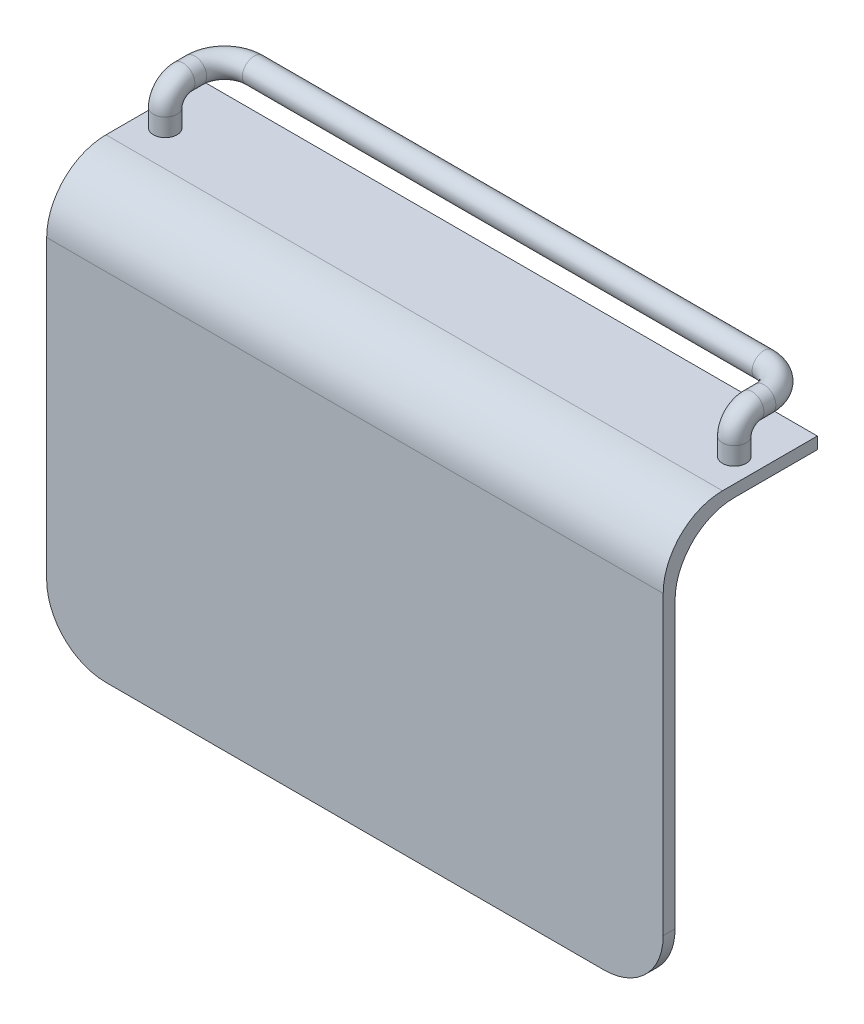
ISO-10303-21;
HEADER;
FILE_DESCRIPTION(('STEP AP214'),'2;1');
FILE_NAME('part.step','',(''),(''),'','','');
FILE_SCHEMA(('AUTOMOTIVE_DESIGN { 1 0 10303 214 1 1 1 1 }'));
ENDSEC;
DATA;
#1=APPLICATION_CONTEXT('core data for automotive mechanical design processes');
#2=APPLICATION_PROTOCOL_DEFINITION('international standard','automotive_design',2000,#1);
#3=PRODUCT_CONTEXT('',#1,'mechanical');
#4=PRODUCT('Part','Part','',(#3));
#5=PRODUCT_RELATED_PRODUCT_CATEGORY('part','',(#4));
#6=PRODUCT_DEFINITION_FORMATION('','',#4);
#7=PRODUCT_DEFINITION_CONTEXT('part definition',#1,'design');
#8=PRODUCT_DEFINITION('design','',#6,#7);
#9=PRODUCT_DEFINITION_SHAPE('','',#8);
#10=(LENGTH_UNIT() NAMED_UNIT(*) SI_UNIT(.MILLI.,.METRE.));
#11=(NAMED_UNIT(*) PLANE_ANGLE_UNIT() SI_UNIT($,.RADIAN.));
#12=(NAMED_UNIT(*) SI_UNIT($,.STERADIAN.) SOLID_ANGLE_UNIT());
#13=UNCERTAINTY_MEASURE_WITH_UNIT(LENGTH_MEASURE(1.E-05),#10,'distance_accuracy_value','');
#14=(GEOMETRIC_REPRESENTATION_CONTEXT(3) GLOBAL_UNCERTAINTY_ASSIGNED_CONTEXT((#13)) GLOBAL_UNIT_ASSIGNED_CONTEXT((#10,
#11,#12)) REPRESENTATION_CONTEXT('',''));
#15=CARTESIAN_POINT('',(0.,0.,0.));
#16=DIRECTION('',(0.,0.,1.));
#17=DIRECTION('',(1.,0.,0.));
#18=AXIS2_PLACEMENT_3D('',#15,#16,#17);
#19=CARTESIAN_POINT('',(-520.,-730.,240.));
#20=DIRECTION('',(0.,0.,1.));
#21=DIRECTION('',(1.,0.,0.));
#22=AXIS2_PLACEMENT_3D('',#19,#20,#21);
#23=PLANE('',#22);
#24=DIRECTION('',(1.,0.,0.));
#25=VECTOR('',#24,1.);
#26=CARTESIAN_POINT('',(-520.,-730.,240.));
#27=LINE('',#26,#25);
#28=CARTESIAN_POINT('',(-491.414284285429,-730.,240.));
#29=VERTEX_POINT('',#28);
#30=CARTESIAN_POINT('',(491.414284285429,-730.,240.));
#31=VERTEX_POINT('',#30);
#32=EDGE_CURVE('E221',#29,#31,#27,.T.);
#33=ORIENTED_EDGE('',*,*,#32,.F.);
#34=CARTESIAN_POINT('',(-420.,-660.,240.));
#35=DIRECTION('',(0.,0.,1.));
#36=DIRECTION('',(1.,0.,0.));
#37=AXIS2_PLACEMENT_3D('',#34,#35,#36);
#38=CIRCLE('',#37,100.);
#39=CARTESIAN_POINT('',(-520.,-660.,240.));
#40=VERTEX_POINT('',#39);
#41=EDGE_CURVE('E207',#29,#40,#38,.F.);
#42=ORIENTED_EDGE('',*,*,#41,.T.);
#43=DIRECTION('',(0.,1.,0.));
#44=VECTOR('',#43,1.);
#45=CARTESIAN_POINT('',(-520.,-730.,240.));
#46=LINE('',#45,#44);
#47=CARTESIAN_POINT('',(-520.,-180.,240.));
#48=VERTEX_POINT('',#47);
#49=EDGE_CURVE('E248',#40,#48,#46,.T.);
#50=ORIENTED_EDGE('',*,*,#49,.T.);
#51=DIRECTION('',(-1.,0.,0.));
#52=VECTOR('',#51,1.);
#53=CARTESIAN_POINT('',(520.,-180.,240.));
#54=LINE('',#53,#52);
#55=CARTESIAN_POINT('',(520.,-180.,240.));
#56=VERTEX_POINT('',#55);
#57=EDGE_CURVE('E238',#56,#48,#54,.T.);
#58=ORIENTED_EDGE('',*,*,#57,.F.);
#59=DIRECTION('',(0.,1.,0.));
#60=VECTOR('',#59,1.);
#61=CARTESIAN_POINT('',(520.,-730.,240.));
#62=LINE('',#61,#60);
#63=CARTESIAN_POINT('',(520.,-660.,240.));
#64=VERTEX_POINT('',#63);
#65=EDGE_CURVE('E246',#64,#56,#62,.T.);
#66=ORIENTED_EDGE('',*,*,#65,.F.);
#67=CARTESIAN_POINT('',(420.,-660.,240.));
#68=DIRECTION('',(0.,0.,1.));
#69=DIRECTION('',(1.,0.,0.));
#70=AXIS2_PLACEMENT_3D('',#67,#68,#69);
#71=CIRCLE('',#70,100.);
#72=EDGE_CURVE('E205',#64,#31,#71,.F.);
#73=ORIENTED_EDGE('',*,*,#72,.T.);
#74=EDGE_LOOP('',(#33,#42,#50,#58,#66,#73));
#75=FACE_BOUND('',#74,.T.);
#76=ADVANCED_FACE('F32',(#75),#23,.F.);
#77=CARTESIAN_POINT('',(0.,-80.0000000000001,0.));
#78=DIRECTION('',(0.,1.,0.));
#79=DIRECTION('',(0.,0.,1.));
#80=AXIS2_PLACEMENT_3D('',#77,#78,#79);
#81=PLANE('',#80);
#82=DIRECTION('',(0.,0.,1.));
#83=VECTOR('',#82,1.);
#84=CARTESIAN_POINT('',(520.,-80.0000000000001,260.));
#85=LINE('',#84,#83);
#86=CARTESIAN_POINT('',(520.,-80.0000000000001,0.));
#87=VERTEX_POINT('',#86);
#88=CARTESIAN_POINT('',(520.,-80.0000000000001,140.));
#89=VERTEX_POINT('',#88);
#90=EDGE_CURVE('E121',#87,#89,#85,.T.);
#91=ORIENTED_EDGE('',*,*,#90,.T.);
#92=DIRECTION('',(-1.,0.,0.));
#93=VECTOR('',#92,1.);
#94=CARTESIAN_POINT('',(520.,-80.,140.));
#95=LINE('',#94,#93);
#96=CARTESIAN_POINT('',(-520.,-80.0000000000001,140.));
#97=VERTEX_POINT('',#96);
#98=EDGE_CURVE('E242',#89,#97,#95,.T.);
#99=ORIENTED_EDGE('',*,*,#98,.T.);
#100=DIRECTION('',(0.,0.,-1.));
#101=VECTOR('',#100,1.);
#102=CARTESIAN_POINT('',(-520.,-80.0000000000001,260.));
#103=LINE('',#102,#101);
#104=CARTESIAN_POINT('',(-520.,-80.0000000000001,0.));
#105=VERTEX_POINT('',#104);
#106=EDGE_CURVE('E131',#97,#105,#103,.T.);
#107=ORIENTED_EDGE('',*,*,#106,.T.);
#108=DIRECTION('',(1.,0.,0.));
#109=VECTOR('',#108,1.);
#110=CARTESIAN_POINT('',(0.,-80.0000000000001,0.));
#111=LINE('',#110,#109);
#112=EDGE_CURVE('E132',#105,#87,#111,.T.);
#113=ORIENTED_EDGE('',*,*,#112,.T.);
#114=EDGE_LOOP('',(#91,#99,#107,#113));
#115=FACE_BOUND('',#114,.T.);
#116=ADVANCED_FACE('F135',(#115),#81,.F.);
#117=CARTESIAN_POINT('',(0.,0.,0.));
#118=DIRECTION('',(-1.,0.,0.));
#119=DIRECTION('',(0.,0.,1.));
#120=AXIS2_PLACEMENT_3D('',#117,#118,#119);
#121=CYLINDRICAL_SURFACE('',#120,20.);
#122=CARTESIAN_POINT('',(-430.,0.,0.));
#123=DIRECTION('',(1.,0.,0.));
#124=DIRECTION('',(0.,1.,0.));
#125=AXIS2_PLACEMENT_3D('',#122,#123,#124);
#126=CIRCLE('',#125,20.);
#127=CARTESIAN_POINT('',(-430.,0.,-20.));
#128=VERTEX_POINT('',#127);
#129=EDGE_CURVE('E166',#128,#128,#126,.T.);
#130=ORIENTED_EDGE('',*,*,#129,.T.);
#131=EDGE_LOOP('',(#130));
#132=FACE_BOUND('',#131,.T.);
#133=CARTESIAN_POINT('',(430.,0.,0.));
#134=DIRECTION('',(1.,0.,0.));
#135=DIRECTION('',(0.,1.,0.));
#136=AXIS2_PLACEMENT_3D('',#133,#134,#135);
#137=CIRCLE('',#136,20.);
#138=CARTESIAN_POINT('',(430.,0.,-20.));
#139=VERTEX_POINT('',#138);
#140=EDGE_CURVE('E155',#139,#139,#137,.F.);
#141=ORIENTED_EDGE('',*,*,#140,.T.);
#142=EDGE_LOOP('',(#141));
#143=FACE_BOUND('',#142,.T.);
#144=ADVANCED_FACE('F290',(#132,#143),#121,.T.);
#145=CARTESIAN_POINT('',(-430.,0.,50.));
#146=DIRECTION('',(0.,1.,0.));
#147=DIRECTION('',(0.,0.,1.));
#148=AXIS2_PLACEMENT_3D('',#145,#146,#147);
#149=TOROIDAL_SURFACE('',#148,50.,20.);
#150=CARTESIAN_POINT('',(-480.,0.,50.));
#151=DIRECTION('',(0.,0.,-1.));
#152=DIRECTION('',(0.,1.,0.));
#153=AXIS2_PLACEMENT_3D('',#150,#151,#152);
#154=CIRCLE('',#153,20.);
#155=CARTESIAN_POINT('',(-500.,0.,50.));
#156=VERTEX_POINT('',#155);
#157=EDGE_CURVE('E170',#156,#156,#154,.T.);
#158=CARTESIAN_POINT('',(-430.,0.,50.));
#159=DIRECTION('',(0.,1.,0.));
#160=DIRECTION('',(0.,0.,1.));
#161=AXIS2_PLACEMENT_3D('',#158,#159,#160);
#162=CIRCLE('',#161,70.);
#163=EDGE_CURVE('',#128,#156,#162,.T.);
#164=ORIENTED_EDGE('',*,*,#129,.F.);
#165=ORIENTED_EDGE('',*,*,#157,.T.);
#166=ORIENTED_EDGE('',*,*,#163,.T.);
#167=ORIENTED_EDGE('',*,*,#163,.F.);
#168=EDGE_LOOP('',(#164,#166,#165,#167));
#169=FACE_BOUND('',#168,.T.);
#170=ADVANCED_FACE('F325',(#169),#149,.T.);
#171=CARTESIAN_POINT('',(-480.,0.,50.));
#172=DIRECTION('',(0.,0.,1.));
#173=DIRECTION('',(0.,-1.,0.));
#174=AXIS2_PLACEMENT_3D('',#171,#172,#173);
#175=CYLINDRICAL_SURFACE('',#174,20.);
#176=CARTESIAN_POINT('',(-480.,0.,70.));
#177=DIRECTION('',(0.,0.,-1.));
#178=DIRECTION('',(0.,1.,0.));
#179=AXIS2_PLACEMENT_3D('',#176,#177,#178);
#180=CIRCLE('',#179,20.);
#181=CARTESIAN_POINT('',(-480.,20.,70.));
#182=VERTEX_POINT('',#181);
#183=EDGE_CURVE('E173',#182,#182,#180,.T.);
#184=ORIENTED_EDGE('',*,*,#183,.T.);
#185=EDGE_LOOP('',(#184));
#186=FACE_BOUND('',#185,.T.);
#187=ORIENTED_EDGE('',*,*,#157,.F.);
#188=EDGE_LOOP('',(#187));
#189=FACE_BOUND('',#188,.T.);
#190=ADVANCED_FACE('F329',(#186,#189),#175,.T.);
#191=CARTESIAN_POINT('',(-480.,-30.,70.));
#192=DIRECTION('',(1.,0.,0.));
#193=DIRECTION('',(0.,0.,-1.));
#194=AXIS2_PLACEMENT_3D('',#191,#192,#193);
#195=TOROIDAL_SURFACE('',#194,30.,20.);
#196=CARTESIAN_POINT('',(-480.,-30.,100.));
#197=DIRECTION('',(0.,1.,0.));
#198=DIRECTION('',(0.,0.,1.));
#199=AXIS2_PLACEMENT_3D('',#196,#197,#198);
#200=CIRCLE('',#199,20.);
#201=CARTESIAN_POINT('',(-480.,-29.9999999999999,120.));
#202=VERTEX_POINT('',#201);
#203=EDGE_CURVE('E176',#202,#202,#200,.T.);
#204=CARTESIAN_POINT('',(-480.,-30.,70.));
#205=DIRECTION('',(1.,0.,0.));
#206=DIRECTION('',(0.,0.,-1.));
#207=AXIS2_PLACEMENT_3D('',#204,#205,#206);
#208=CIRCLE('',#207,50.);
#209=EDGE_CURVE('',#182,#202,#208,.T.);
#210=ORIENTED_EDGE('',*,*,#183,.F.);
#211=ORIENTED_EDGE('',*,*,#203,.T.);
#212=ORIENTED_EDGE('',*,*,#209,.T.);
#213=ORIENTED_EDGE('',*,*,#209,.F.);
#214=EDGE_LOOP('',(#210,#212,#211,#213));
#215=FACE_BOUND('',#214,.T.);
#216=ADVANCED_FACE('F333',(#215),#195,.T.);
#217=CARTESIAN_POINT('',(-480.,-30.,100.));
#218=DIRECTION('',(0.,-1.,0.));
#219=DIRECTION('',(0.,0.,-1.));
#220=AXIS2_PLACEMENT_3D('',#217,#218,#219);
#221=CYLINDRICAL_SURFACE('',#220,20.);
#222=CARTESIAN_POINT('',(-480.,-60.0000000000001,100.));
#223=DIRECTION('',(0.,1.,0.));
#224=DIRECTION('',(0.,0.,1.));
#225=AXIS2_PLACEMENT_3D('',#222,#223,#224);
#226=CIRCLE('',#225,20.);
#227=CARTESIAN_POINT('',(-480.,-60.0000000000001,120.));
#228=VERTEX_POINT('',#227);
#229=EDGE_CURVE('E149',#228,#228,#226,.T.);
#230=ORIENTED_EDGE('',*,*,#229,.T.);
#231=EDGE_LOOP('',(#230));
#232=FACE_BOUND('',#231,.T.);
#233=ORIENTED_EDGE('',*,*,#203,.F.);
#234=EDGE_LOOP('',(#233));
#235=FACE_BOUND('',#234,.T.);
#236=ADVANCED_FACE('F292',(#232,#235),#221,.T.);
#237=CARTESIAN_POINT('',(430.,0.,50.));
#238=DIRECTION('',(0.,-1.,0.));
#239=DIRECTION('',(0.,0.,-1.));
#240=AXIS2_PLACEMENT_3D('',#237,#238,#239);
#241=TOROIDAL_SURFACE('',#240,50.,20.);
#242=CARTESIAN_POINT('',(480.,0.,50.));
#243=DIRECTION('',(0.,0.,1.));
#244=DIRECTION('',(0.,1.,0.));
#245=AXIS2_PLACEMENT_3D('',#242,#243,#244);
#246=CIRCLE('',#245,20.);
#247=CARTESIAN_POINT('',(500.,0.,50.));
#248=VERTEX_POINT('',#247);
#249=EDGE_CURVE('E158',#248,#248,#246,.F.);
#250=CARTESIAN_POINT('',(430.,0.,50.));
#251=DIRECTION('',(0.,-1.,0.));
#252=DIRECTION('',(0.,0.,-1.));
#253=AXIS2_PLACEMENT_3D('',#250,#251,#252);
#254=CIRCLE('',#253,70.);
#255=EDGE_CURVE('',#139,#248,#254,.T.);
#256=ORIENTED_EDGE('',*,*,#140,.F.);
#257=ORIENTED_EDGE('',*,*,#249,.T.);
#258=ORIENTED_EDGE('',*,*,#255,.T.);
#259=ORIENTED_EDGE('',*,*,#255,.F.);
#260=EDGE_LOOP('',(#256,#258,#257,#259));
#261=FACE_BOUND('',#260,.T.);
#262=ADVANCED_FACE('F308',(#261),#241,.T.);
#263=CARTESIAN_POINT('',(480.,0.,50.));
#264=DIRECTION('',(0.,0.,1.));
#265=DIRECTION('',(0.,-1.,0.));
#266=AXIS2_PLACEMENT_3D('',#263,#264,#265);
#267=CYLINDRICAL_SURFACE('',#266,20.);
#268=CARTESIAN_POINT('',(480.,0.,70.));
#269=DIRECTION('',(0.,0.,1.));
#270=DIRECTION('',(0.,1.,0.));
#271=AXIS2_PLACEMENT_3D('',#268,#269,#270);
#272=CIRCLE('',#271,20.);
#273=CARTESIAN_POINT('',(480.,20.,70.));
#274=VERTEX_POINT('',#273);
#275=EDGE_CURVE('E161',#274,#274,#272,.F.);
#276=ORIENTED_EDGE('',*,*,#275,.T.);
#277=EDGE_LOOP('',(#276));
#278=FACE_BOUND('',#277,.T.);
#279=ORIENTED_EDGE('',*,*,#249,.F.);
#280=EDGE_LOOP('',(#279));
#281=FACE_BOUND('',#280,.T.);
#282=ADVANCED_FACE('F311',(#278,#281),#267,.T.);
#283=CARTESIAN_POINT('',(480.,-30.,70.));
#284=DIRECTION('',(1.,0.,0.));
#285=DIRECTION('',(0.,0.,-1.));
#286=AXIS2_PLACEMENT_3D('',#283,#284,#285);
#287=TOROIDAL_SURFACE('',#286,30.,20.);
#288=CARTESIAN_POINT('',(480.,-30.,100.));
#289=DIRECTION('',(0.,-1.,0.));
#290=DIRECTION('',(0.,0.,1.));
#291=AXIS2_PLACEMENT_3D('',#288,#289,#290);
#292=CIRCLE('',#291,20.);
#293=CARTESIAN_POINT('',(480.,-29.9999999999999,120.));
#294=VERTEX_POINT('',#293);
#295=EDGE_CURVE('E164',#294,#294,#292,.F.);
#296=CARTESIAN_POINT('',(480.,-30.,70.));
#297=DIRECTION('',(1.,0.,0.));
#298=DIRECTION('',(0.,0.,-1.));
#299=AXIS2_PLACEMENT_3D('',#296,#297,#298);
#300=CIRCLE('',#299,50.);
#301=EDGE_CURVE('',#274,#294,#300,.T.);
#302=ORIENTED_EDGE('',*,*,#275,.F.);
#303=ORIENTED_EDGE('',*,*,#295,.T.);
#304=ORIENTED_EDGE('',*,*,#301,.T.);
#305=ORIENTED_EDGE('',*,*,#301,.F.);
#306=EDGE_LOOP('',(#302,#304,#303,#305));
#307=FACE_BOUND('',#306,.T.);
#308=ADVANCED_FACE('F315',(#307),#287,.T.);
#309=CARTESIAN_POINT('',(480.,-30.,100.));
#310=DIRECTION('',(0.,-1.,0.));
#311=DIRECTION('',(0.,0.,-1.));
#312=AXIS2_PLACEMENT_3D('',#309,#310,#311);
#313=CYLINDRICAL_SURFACE('',#312,20.);
#314=CARTESIAN_POINT('',(480.,-60.0000000000001,100.));
#315=DIRECTION('',(0.,-1.,0.));
#316=DIRECTION('',(0.,0.,1.));
#317=AXIS2_PLACEMENT_3D('',#314,#315,#316);
#318=CIRCLE('',#317,20.);
#319=CARTESIAN_POINT('',(480.,-60.0000000000001,120.));
#320=VERTEX_POINT('',#319);
#321=EDGE_CURVE('E145',#320,#320,#318,.F.);
#322=ORIENTED_EDGE('',*,*,#321,.T.);
#323=EDGE_LOOP('',(#322));
#324=FACE_BOUND('',#323,.T.);
#325=ORIENTED_EDGE('',*,*,#295,.F.);
#326=EDGE_LOOP('',(#325));
#327=FACE_BOUND('',#326,.T.);
#328=ADVANCED_FACE('F307',(#324,#327),#313,.T.);
#329=CARTESIAN_POINT('',(520.,-80.0000000000001,260.));
#330=DIRECTION('',(-1.,0.,0.));
#331=DIRECTION('',(0.,0.,1.));
#332=AXIS2_PLACEMENT_3D('',#329,#330,#331);
#333=PLANE('',#332);
#334=DIRECTION('',(0.,1.,0.));
#335=VECTOR('',#334,1.);
#336=CARTESIAN_POINT('',(520.,-80.0000000000001,260.));
#337=LINE('',#336,#335);
#338=CARTESIAN_POINT('',(520.,-660.,260.));
#339=VERTEX_POINT('',#338);
#340=CARTESIAN_POINT('',(520.,-160.,260.));
#341=VERTEX_POINT('',#340);
#342=EDGE_CURVE('E146',#339,#341,#337,.T.);
#343=ORIENTED_EDGE('',*,*,#342,.F.);
#344=DIRECTION('',(0.,0.,1.));
#345=VECTOR('',#344,1.);
#346=CARTESIAN_POINT('',(520.,-660.,260.));
#347=LINE('',#346,#345);
#348=EDGE_CURVE('E11',#339,#64,#347,.F.);
#349=ORIENTED_EDGE('',*,*,#348,.T.);
#350=ORIENTED_EDGE('',*,*,#65,.T.);
#351=CARTESIAN_POINT('',(520.,-180.,140.));
#352=DIRECTION('',(-1.,0.,0.));
#353=DIRECTION('',(0.,0.,-1.));
#354=AXIS2_PLACEMENT_3D('',#351,#352,#353);
#355=CIRCLE('',#354,100.);
#356=EDGE_CURVE('E128',#56,#89,#355,.T.);
#357=ORIENTED_EDGE('',*,*,#356,.T.);
#358=ORIENTED_EDGE('',*,*,#90,.F.);
#359=DIRECTION('',(0.,1.,0.));
#360=VECTOR('',#359,1.);
#361=CARTESIAN_POINT('',(520.,-80.0000000000001,0.));
#362=LINE('',#361,#360);
#363=CARTESIAN_POINT('',(520.,-60.0000000000001,0.));
#364=VERTEX_POINT('',#363);
#365=EDGE_CURVE('E126',#87,#364,#362,.T.);
#366=ORIENTED_EDGE('',*,*,#365,.T.);
#367=DIRECTION('',(0.,0.,1.));
#368=VECTOR('',#367,1.);
#369=CARTESIAN_POINT('',(520.,-60.0000000000001,260.));
#370=LINE('',#369,#368);
#371=CARTESIAN_POINT('',(520.,-60.0000000000001,160.));
#372=VERTEX_POINT('',#371);
#373=EDGE_CURVE('E249',#364,#372,#370,.T.);
#374=ORIENTED_EDGE('',*,*,#373,.T.);
#375=CARTESIAN_POINT('',(520.,-160.,160.));
#376=DIRECTION('',(-1.,0.,0.));
#377=DIRECTION('',(0.,0.,1.));
#378=AXIS2_PLACEMENT_3D('',#375,#376,#377);
#379=CIRCLE('',#378,100.);
#380=EDGE_CURVE('E188',#372,#341,#379,.F.);
#381=ORIENTED_EDGE('',*,*,#380,.T.);
#382=EDGE_LOOP('',(#343,#349,#350,#357,#358,#366,#374,#381));
#383=FACE_BOUND('',#382,.T.);
#384=ADVANCED_FACE('F123',(#383),#333,.F.);
#385=CARTESIAN_POINT('',(520.,-80.0000000000001,260.));
#386=DIRECTION('',(0.,0.,-1.));
#387=DIRECTION('',(-1.,0.,0.));
#388=AXIS2_PLACEMENT_3D('',#385,#386,#387);
#389=PLANE('',#388);
#390=DIRECTION('',(0.,1.,0.));
#391=VECTOR('',#390,1.);
#392=CARTESIAN_POINT('',(-520.,-80.0000000000001,260.));
#393=LINE('',#392,#391);
#394=CARTESIAN_POINT('',(-520.,-660.,260.));
#395=VERTEX_POINT('',#394);
#396=CARTESIAN_POINT('',(-520.,-160.,260.));
#397=VERTEX_POINT('',#396);
#398=EDGE_CURVE('E151',#395,#397,#393,.T.);
#399=ORIENTED_EDGE('',*,*,#398,.F.);
#400=CARTESIAN_POINT('',(-420.,-660.,260.));
#401=DIRECTION('',(0.,0.,-1.));
#402=DIRECTION('',(-1.,0.,0.));
#403=AXIS2_PLACEMENT_3D('',#400,#401,#402);
#404=CIRCLE('',#403,100.);
#405=CARTESIAN_POINT('',(-420.,-760.,260.));
#406=VERTEX_POINT('',#405);
#407=EDGE_CURVE('E40',#395,#406,#404,.F.);
#408=ORIENTED_EDGE('',*,*,#407,.T.);
#409=DIRECTION('',(-1.,0.,0.));
#410=VECTOR('',#409,1.);
#411=CARTESIAN_POINT('',(-520.,-760.,260.));
#412=LINE('',#411,#410);
#413=CARTESIAN_POINT('',(420.,-760.,260.));
#414=VERTEX_POINT('',#413);
#415=EDGE_CURVE('E213',#414,#406,#412,.T.);
#416=ORIENTED_EDGE('',*,*,#415,.F.);
#417=CARTESIAN_POINT('',(420.,-660.,260.));
#418=DIRECTION('',(0.,0.,-1.));
#419=DIRECTION('',(-1.,0.,0.));
#420=AXIS2_PLACEMENT_3D('',#417,#418,#419);
#421=CIRCLE('',#420,100.);
#422=EDGE_CURVE('E47',#414,#339,#421,.F.);
#423=ORIENTED_EDGE('',*,*,#422,.T.);
#424=ORIENTED_EDGE('',*,*,#342,.T.);
#425=DIRECTION('',(-1.,0.,0.));
#426=VECTOR('',#425,1.);
#427=CARTESIAN_POINT('',(-520.,-160.,260.));
#428=LINE('',#427,#426);
#429=EDGE_CURVE('E179',#341,#397,#428,.T.);
#430=ORIENTED_EDGE('',*,*,#429,.T.);
#431=EDGE_LOOP('',(#399,#408,#416,#423,#424,#430));
#432=FACE_BOUND('',#431,.T.);
#433=ADVANCED_FACE('F212',(#432),#389,.F.);
#434=CARTESIAN_POINT('',(-520.,-80.0000000000001,260.));
#435=DIRECTION('',(1.,0.,0.));
#436=DIRECTION('',(0.,0.,-1.));
#437=AXIS2_PLACEMENT_3D('',#434,#435,#436);
#438=PLANE('',#437);
#439=ORIENTED_EDGE('',*,*,#49,.F.);
#440=DIRECTION('',(0.,0.,-1.));
#441=VECTOR('',#440,1.);
#442=CARTESIAN_POINT('',(-520.,-660.,260.));
#443=LINE('',#442,#441);
#444=EDGE_CURVE('E55',#40,#395,#443,.F.);
#445=ORIENTED_EDGE('',*,*,#444,.T.);
#446=ORIENTED_EDGE('',*,*,#398,.T.);
#447=CARTESIAN_POINT('',(-520.,-160.,160.));
#448=DIRECTION('',(1.,0.,0.));
#449=DIRECTION('',(0.,0.,-1.));
#450=AXIS2_PLACEMENT_3D('',#447,#448,#449);
#451=CIRCLE('',#450,100.);
#452=CARTESIAN_POINT('',(-520.,-60.0000000000001,160.));
#453=VERTEX_POINT('',#452);
#454=EDGE_CURVE('E184',#397,#453,#451,.F.);
#455=ORIENTED_EDGE('',*,*,#454,.T.);
#456=DIRECTION('',(0.,0.,-1.));
#457=VECTOR('',#456,1.);
#458=CARTESIAN_POINT('',(-520.,-60.0000000000001,260.));
#459=LINE('',#458,#457);
#460=CARTESIAN_POINT('',(-520.,-60.0000000000001,0.));
#461=VERTEX_POINT('',#460);
#462=EDGE_CURVE('E254',#453,#461,#459,.T.);
#463=ORIENTED_EDGE('',*,*,#462,.T.);
#464=DIRECTION('',(0.,1.,0.));
#465=VECTOR('',#464,1.);
#466=CARTESIAN_POINT('',(-520.,-80.0000000000001,0.));
#467=LINE('',#466,#465);
#468=EDGE_CURVE('E252',#105,#461,#467,.T.);
#469=ORIENTED_EDGE('',*,*,#468,.F.);
#470=ORIENTED_EDGE('',*,*,#106,.F.);
#471=CARTESIAN_POINT('',(-520.,-180.,140.));
#472=DIRECTION('',(-1.,0.,0.));
#473=DIRECTION('',(0.,0.,-1.));
#474=AXIS2_PLACEMENT_3D('',#471,#472,#473);
#475=CIRCLE('',#474,100.);
#476=EDGE_CURVE('E270',#48,#97,#475,.T.);
#477=ORIENTED_EDGE('',*,*,#476,.F.);
#478=EDGE_LOOP('',(#439,#445,#446,#455,#463,#469,#470,#477));
#479=FACE_BOUND('',#478,.T.);
#480=ADVANCED_FACE('F258',(#479),#438,.F.);
#481=CARTESIAN_POINT('',(0.,-80.0000000000001,0.));
#482=DIRECTION('',(0.,0.,1.));
#483=DIRECTION('',(1.,0.,0.));
#484=AXIS2_PLACEMENT_3D('',#481,#482,#483);
#485=PLANE('',#484);
#486=DIRECTION('',(1.,0.,0.));
#487=VECTOR('',#486,1.);
#488=CARTESIAN_POINT('',(0.,-60.0000000000001,0.));
#489=LINE('',#488,#487);
#490=EDGE_CURVE('E140',#461,#364,#489,.T.);
#491=ORIENTED_EDGE('',*,*,#490,.T.);
#492=ORIENTED_EDGE('',*,*,#365,.F.);
#493=ORIENTED_EDGE('',*,*,#112,.F.);
#494=ORIENTED_EDGE('',*,*,#468,.T.);
#495=EDGE_LOOP('',(#491,#492,#493,#494));
#496=FACE_BOUND('',#495,.T.);
#497=ADVANCED_FACE('F142',(#496),#485,.F.);
#498=CARTESIAN_POINT('',(0.,-60.0000000000001,0.));
#499=DIRECTION('',(0.,1.,0.));
#500=DIRECTION('',(0.,0.,1.));
#501=AXIS2_PLACEMENT_3D('',#498,#499,#500);
#502=PLANE('',#501);
#503=ORIENTED_EDGE('',*,*,#229,.F.);
#504=EDGE_LOOP('',(#503));
#505=FACE_BOUND('',#504,.T.);
#506=ORIENTED_EDGE('',*,*,#321,.F.);
#507=EDGE_LOOP('',(#506));
#508=FACE_BOUND('',#507,.T.);
#509=ORIENTED_EDGE('',*,*,#462,.F.);
#510=DIRECTION('',(-1.,0.,0.));
#511=VECTOR('',#510,1.);
#512=CARTESIAN_POINT('',(520.,-60.0000000000001,160.));
#513=LINE('',#512,#511);
#514=EDGE_CURVE('E186',#453,#372,#513,.F.);
#515=ORIENTED_EDGE('',*,*,#514,.T.);
#516=ORIENTED_EDGE('',*,*,#373,.F.);
#517=ORIENTED_EDGE('',*,*,#490,.F.);
#518=EDGE_LOOP('',(#509,#515,#516,#517));
#519=FACE_BOUND('',#518,.T.);
#520=ADVANCED_FACE('F267',(#505,#508,#519),#502,.T.);
#521=CARTESIAN_POINT('',(0.,-730.,0.));
#522=DIRECTION('',(0.,-1.,0.));
#523=DIRECTION('',(0.,0.,-1.));
#524=AXIS2_PLACEMENT_3D('',#521,#522,#523);
#525=PLANE('',#524);
#526=DIRECTION('',(1.,0.,0.));
#527=VECTOR('',#526,1.);
#528=CARTESIAN_POINT('',(520.,-730.,250.));
#529=LINE('',#528,#527);
#530=CARTESIAN_POINT('',(-491.414284285429,-730.,250.));
#531=VERTEX_POINT('',#530);
#532=CARTESIAN_POINT('',(491.414284285429,-730.,250.));
#533=VERTEX_POINT('',#532);
#534=EDGE_CURVE('E231',#531,#533,#529,.T.);
#535=ORIENTED_EDGE('',*,*,#534,.F.);
#536=DIRECTION('',(0.,0.,-1.));
#537=VECTOR('',#536,1.);
#538=CARTESIAN_POINT('',(-491.414284285429,-730.,250.));
#539=LINE('',#538,#537);
#540=EDGE_CURVE('E203',#531,#29,#539,.T.);
#541=ORIENTED_EDGE('',*,*,#540,.T.);
#542=ORIENTED_EDGE('',*,*,#32,.T.);
#543=DIRECTION('',(0.,0.,1.));
#544=VECTOR('',#543,1.);
#545=CARTESIAN_POINT('',(491.414284285429,-730.,240.));
#546=LINE('',#545,#544);
#547=EDGE_CURVE('E201',#31,#533,#546,.T.);
#548=ORIENTED_EDGE('',*,*,#547,.T.);
#549=EDGE_LOOP('',(#535,#541,#542,#548));
#550=FACE_BOUND('',#549,.T.);
#551=ADVANCED_FACE('F234',(#550),#525,.T.);
#552=CARTESIAN_POINT('',(520.,-760.,250.));
#553=DIRECTION('',(0.,0.,1.));
#554=DIRECTION('',(1.,0.,0.));
#555=AXIS2_PLACEMENT_3D('',#552,#553,#554);
#556=PLANE('',#555);
#557=DIRECTION('',(1.,0.,0.));
#558=VECTOR('',#557,1.);
#559=CARTESIAN_POINT('',(520.,-760.,250.));
#560=LINE('',#559,#558);
#561=CARTESIAN_POINT('',(-420.,-760.,250.));
#562=VERTEX_POINT('',#561);
#563=CARTESIAN_POINT('',(420.,-760.,250.));
#564=VERTEX_POINT('',#563);
#565=EDGE_CURVE('E222',#562,#564,#560,.T.);
#566=ORIENTED_EDGE('',*,*,#565,.F.);
#567=CARTESIAN_POINT('',(-420.,-660.,250.));
#568=DIRECTION('',(0.,0.,1.));
#569=DIRECTION('',(1.,0.,0.));
#570=AXIS2_PLACEMENT_3D('',#567,#568,#569);
#571=CIRCLE('',#570,100.);
#572=EDGE_CURVE('E199',#562,#531,#571,.F.);
#573=ORIENTED_EDGE('',*,*,#572,.T.);
#574=ORIENTED_EDGE('',*,*,#534,.T.);
#575=CARTESIAN_POINT('',(420.,-660.,250.));
#576=DIRECTION('',(0.,0.,1.));
#577=DIRECTION('',(1.,0.,0.));
#578=AXIS2_PLACEMENT_3D('',#575,#576,#577);
#579=CIRCLE('',#578,100.);
#580=EDGE_CURVE('E197',#533,#564,#579,.F.);
#581=ORIENTED_EDGE('',*,*,#580,.T.);
#582=EDGE_LOOP('',(#566,#573,#574,#581));
#583=FACE_BOUND('',#582,.T.);
#584=ADVANCED_FACE('F230',(#583),#556,.F.);
#585=CARTESIAN_POINT('',(0.,-760.,0.));
#586=DIRECTION('',(0.,1.,0.));
#587=DIRECTION('',(0.,0.,1.));
#588=AXIS2_PLACEMENT_3D('',#585,#586,#587);
#589=PLANE('',#588);
#590=ORIENTED_EDGE('',*,*,#415,.T.);
#591=DIRECTION('',(0.,0.,-1.));
#592=VECTOR('',#591,1.);
#593=CARTESIAN_POINT('',(-420.,-760.,0.));
#594=LINE('',#593,#592);
#595=EDGE_CURVE('E194',#406,#562,#594,.T.);
#596=ORIENTED_EDGE('',*,*,#595,.T.);
#597=ORIENTED_EDGE('',*,*,#565,.T.);
#598=DIRECTION('',(0.,0.,1.));
#599=VECTOR('',#598,1.);
#600=CARTESIAN_POINT('',(420.,-760.,0.));
#601=LINE('',#600,#599);
#602=EDGE_CURVE('E191',#564,#414,#601,.T.);
#603=ORIENTED_EDGE('',*,*,#602,.T.);
#604=EDGE_LOOP('',(#590,#596,#597,#603));
#605=FACE_BOUND('',#604,.T.);
#606=ADVANCED_FACE('F217',(#605),#589,.F.);
#607=CARTESIAN_POINT('',(520.,-180.,140.));
#608=DIRECTION('',(-1.,0.,0.));
#609=DIRECTION('',(0.,0.,1.));
#610=AXIS2_PLACEMENT_3D('',#607,#608,#609);
#611=CYLINDRICAL_SURFACE('',#610,100.);
#612=ORIENTED_EDGE('',*,*,#476,.T.);
#613=ORIENTED_EDGE('',*,*,#98,.F.);
#614=ORIENTED_EDGE('',*,*,#356,.F.);
#615=ORIENTED_EDGE('',*,*,#57,.T.);
#616=EDGE_LOOP('',(#612,#613,#614,#615));
#617=FACE_BOUND('',#616,.T.);
#618=ADVANCED_FACE('F272',(#617),#611,.F.);
#619=CARTESIAN_POINT('',(520.,-160.,160.));
#620=DIRECTION('',(1.,0.,0.));
#621=DIRECTION('',(0.,0.,-1.));
#622=AXIS2_PLACEMENT_3D('',#619,#620,#621);
#623=CYLINDRICAL_SURFACE('',#622,100.);
#624=ORIENTED_EDGE('',*,*,#380,.F.);
#625=ORIENTED_EDGE('',*,*,#514,.F.);
#626=ORIENTED_EDGE('',*,*,#454,.F.);
#627=ORIENTED_EDGE('',*,*,#429,.F.);
#628=EDGE_LOOP('',(#624,#625,#626,#627));
#629=FACE_BOUND('',#628,.T.);
#630=ADVANCED_FACE('F264',(#629),#623,.T.);
#631=CARTESIAN_POINT('',(-420.,-660.,0.));
#632=DIRECTION('',(0.,0.,-1.));
#633=DIRECTION('',(-1.,0.,0.));
#634=AXIS2_PLACEMENT_3D('',#631,#632,#633);
#635=CYLINDRICAL_SURFACE('',#634,100.);
#636=ORIENTED_EDGE('',*,*,#407,.F.);
#637=ORIENTED_EDGE('',*,*,#444,.F.);
#638=ORIENTED_EDGE('',*,*,#41,.F.);
#639=ORIENTED_EDGE('',*,*,#540,.F.);
#640=ORIENTED_EDGE('',*,*,#572,.F.);
#641=ORIENTED_EDGE('',*,*,#595,.F.);
#642=EDGE_LOOP('',(#636,#637,#638,#639,#640,#641));
#643=FACE_BOUND('',#642,.T.);
#644=ADVANCED_FACE('F224',(#643),#635,.T.);
#645=CARTESIAN_POINT('',(420.,-660.,0.));
#646=DIRECTION('',(0.,0.,1.));
#647=DIRECTION('',(1.,0.,0.));
#648=AXIS2_PLACEMENT_3D('',#645,#646,#647);
#649=CYLINDRICAL_SURFACE('',#648,100.);
#650=ORIENTED_EDGE('',*,*,#72,.F.);
#651=ORIENTED_EDGE('',*,*,#348,.F.);
#652=ORIENTED_EDGE('',*,*,#422,.F.);
#653=ORIENTED_EDGE('',*,*,#602,.F.);
#654=ORIENTED_EDGE('',*,*,#580,.F.);
#655=ORIENTED_EDGE('',*,*,#547,.F.);
#656=EDGE_LOOP('',(#650,#651,#652,#653,#654,#655));
#657=FACE_BOUND('',#656,.T.);
#658=ADVANCED_FACE('F34',(#657),#649,.T.);
#659=CLOSED_SHELL('',(#76,#116,#144,#170,#190,#216,#236,#262,#282,#308,#328,#384,#433,#480,#497,
#520,#551,#584,#606,#618,#630,#644,#658));
#660=MANIFOLD_SOLID_BREP('B2',#659);
#661=ADVANCED_BREP_SHAPE_REPRESENTATION('',(#18,#660),#14);
#662=SHAPE_DEFINITION_REPRESENTATION(#9,#661);
ENDSEC;
END-ISO-10303-21;
